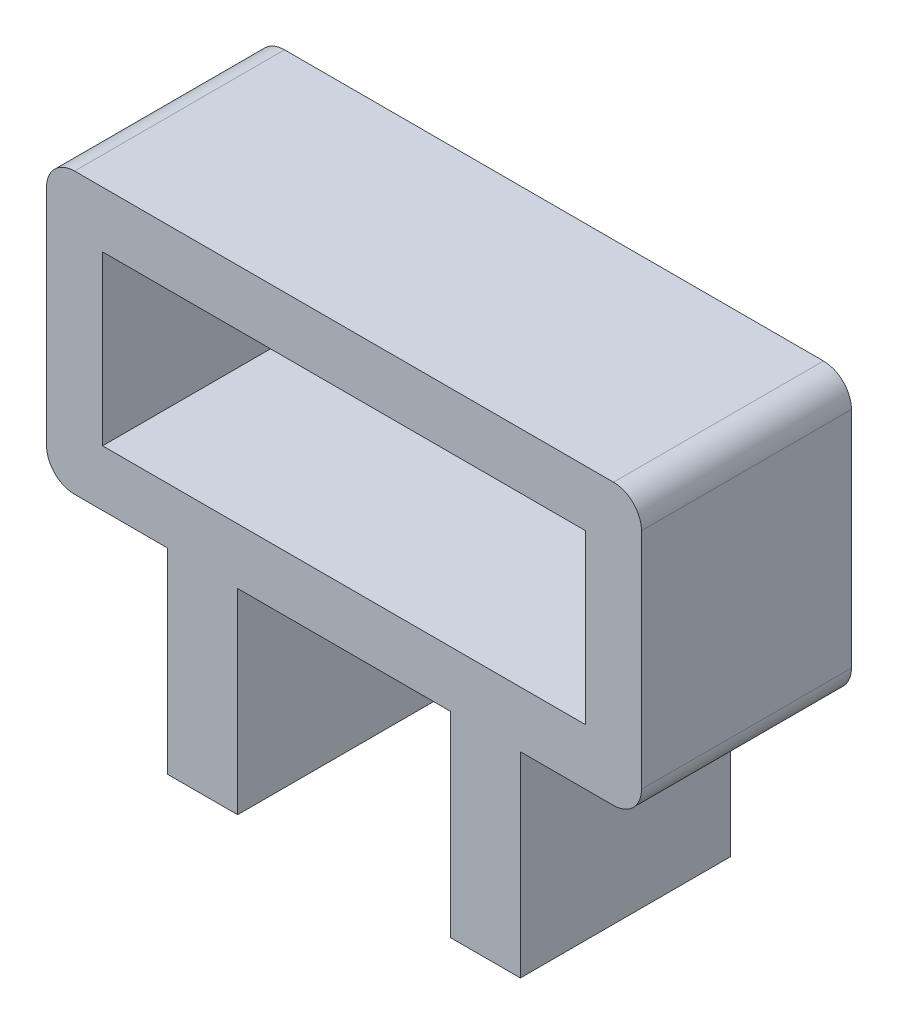
ISO-10303-21;
HEADER;
FILE_DESCRIPTION(('STEP AP214'),'2;1');
FILE_NAME('part.step','',(''),(''),'','','');
FILE_SCHEMA(('AUTOMOTIVE_DESIGN { 1 0 10303 214 1 1 1 1 }'));
ENDSEC;
DATA;
#1=APPLICATION_CONTEXT('core data for automotive mechanical design processes');
#2=APPLICATION_PROTOCOL_DEFINITION('international standard','automotive_design',2000,#1);
#3=PRODUCT_CONTEXT('',#1,'mechanical');
#4=PRODUCT('Part','Part','',(#3));
#5=PRODUCT_RELATED_PRODUCT_CATEGORY('part','',(#4));
#6=PRODUCT_DEFINITION_FORMATION('','',#4);
#7=PRODUCT_DEFINITION_CONTEXT('part definition',#1,'design');
#8=PRODUCT_DEFINITION('design','',#6,#7);
#9=PRODUCT_DEFINITION_SHAPE('','',#8);
#10=(LENGTH_UNIT() NAMED_UNIT(*) SI_UNIT(.MILLI.,.METRE.));
#11=(NAMED_UNIT(*) PLANE_ANGLE_UNIT() SI_UNIT($,.RADIAN.));
#12=(NAMED_UNIT(*) SI_UNIT($,.STERADIAN.) SOLID_ANGLE_UNIT());
#13=UNCERTAINTY_MEASURE_WITH_UNIT(LENGTH_MEASURE(1.E-05),#10,'distance_accuracy_value','');
#14=(GEOMETRIC_REPRESENTATION_CONTEXT(3) GLOBAL_UNCERTAINTY_ASSIGNED_CONTEXT((#13)) GLOBAL_UNIT_ASSIGNED_CONTEXT((#10,
#11,#12)) REPRESENTATION_CONTEXT('',''));
#15=CARTESIAN_POINT('',(0.,0.,0.));
#16=DIRECTION('',(0.,0.,1.));
#17=DIRECTION('',(1.,0.,0.));
#18=AXIS2_PLACEMENT_3D('',#15,#16,#17);
#19=CARTESIAN_POINT('',(0.,0.,15.));
#20=DIRECTION('',(0.,0.,-1.));
#21=DIRECTION('',(-1.,0.,0.));
#22=AXIS2_PLACEMENT_3D('',#19,#20,#21);
#23=PLANE('',#22);
#24=DIRECTION('',(0.,-1.,0.));
#25=VECTOR('',#24,1.);
#26=CARTESIAN_POINT('',(-40.8047171963891,20.4370103244966,15.));
#27=LINE('',#26,#25);
#28=CARTESIAN_POINT('',(-40.8047171963891,18.4370103244966,15.));
#29=VERTEX_POINT('',#28);
#30=CARTESIAN_POINT('',(-40.8047171963891,2.43701032449661,15.));
#31=VERTEX_POINT('',#30);
#32=EDGE_CURVE('E220',#29,#31,#27,.T.);
#33=ORIENTED_EDGE('',*,*,#32,.T.);
#34=CARTESIAN_POINT('',(-38.8047171963891,2.43701032449661,15.));
#35=DIRECTION('',(0.,0.,-1.));
#36=DIRECTION('',(-1.,0.,0.));
#37=AXIS2_PLACEMENT_3D('',#34,#35,#36);
#38=CIRCLE('',#37,2.);
#39=CARTESIAN_POINT('',(-38.8047171963891,0.437010324496612,15.));
#40=VERTEX_POINT('',#39);
#41=EDGE_CURVE('E309',#31,#40,#38,.F.);
#42=ORIENTED_EDGE('',*,*,#41,.T.);
#43=DIRECTION('',(1.,0.,0.));
#44=VECTOR('',#43,1.);
#45=CARTESIAN_POINT('',(-40.8047171963891,0.437010324496612,15.));
#46=LINE('',#45,#44);
#47=CARTESIAN_POINT('',(-32.1547171963891,0.437010324496613,15.));
#48=VERTEX_POINT('',#47);
#49=EDGE_CURVE('E223',#40,#48,#46,.T.);
#50=ORIENTED_EDGE('',*,*,#49,.T.);
#51=DIRECTION('',(0.,-1.,0.));
#52=VECTOR('',#51,1.);
#53=CARTESIAN_POINT('',(-32.1547171963891,-13.5629896755034,15.));
#54=LINE('',#53,#52);
#55=CARTESIAN_POINT('',(-32.1547171963891,-13.5629896755034,15.));
#56=VERTEX_POINT('',#55);
#57=EDGE_CURVE('E225',#48,#56,#54,.T.);
#58=ORIENTED_EDGE('',*,*,#57,.T.);
#59=DIRECTION('',(1.,0.,0.));
#60=VECTOR('',#59,1.);
#61=CARTESIAN_POINT('',(-27.1547171963891,-13.5629896755034,15.));
#62=LINE('',#61,#60);
#63=CARTESIAN_POINT('',(-27.1547171963891,-13.5629896755034,15.));
#64=VERTEX_POINT('',#63);
#65=EDGE_CURVE('E227',#56,#64,#62,.T.);
#66=ORIENTED_EDGE('',*,*,#65,.T.);
#67=DIRECTION('',(0.,1.,0.));
#68=VECTOR('',#67,1.);
#69=CARTESIAN_POINT('',(-27.1547171963891,0.437010324496613,15.));
#70=LINE('',#69,#68);
#71=CARTESIAN_POINT('',(-27.1547171963891,0.437010324496613,15.));
#72=VERTEX_POINT('',#71);
#73=EDGE_CURVE('E229',#64,#72,#70,.T.);
#74=ORIENTED_EDGE('',*,*,#73,.T.);
#75=DIRECTION('',(1.,0.,0.));
#76=VECTOR('',#75,1.);
#77=CARTESIAN_POINT('',(-27.1547171963891,0.437010324496613,15.));
#78=LINE('',#77,#76);
#79=CARTESIAN_POINT('',(-11.9547171963891,0.437010324496613,15.));
#80=VERTEX_POINT('',#79);
#81=EDGE_CURVE('E231',#72,#80,#78,.T.);
#82=ORIENTED_EDGE('',*,*,#81,.T.);
#83=DIRECTION('',(0.,-1.,0.));
#84=VECTOR('',#83,1.);
#85=CARTESIAN_POINT('',(-11.9547171963891,0.437010324496613,15.));
#86=LINE('',#85,#84);
#87=CARTESIAN_POINT('',(-11.9547171963891,-13.5629896755034,15.));
#88=VERTEX_POINT('',#87);
#89=EDGE_CURVE('E233',#80,#88,#86,.T.);
#90=ORIENTED_EDGE('',*,*,#89,.T.);
#91=DIRECTION('',(1.,0.,0.));
#92=VECTOR('',#91,1.);
#93=CARTESIAN_POINT('',(-11.9547171963891,-13.5629896755034,15.));
#94=LINE('',#93,#92);
#95=CARTESIAN_POINT('',(-6.95471719638909,-13.5629896755034,15.));
#96=VERTEX_POINT('',#95);
#97=EDGE_CURVE('E235',#88,#96,#94,.T.);
#98=ORIENTED_EDGE('',*,*,#97,.T.);
#99=DIRECTION('',(0.,1.,0.));
#100=VECTOR('',#99,1.);
#101=CARTESIAN_POINT('',(-6.95471719638909,-13.5629896755034,15.));
#102=LINE('',#101,#100);
#103=CARTESIAN_POINT('',(-6.95471719638909,0.437010324496613,15.));
#104=VERTEX_POINT('',#103);
#105=EDGE_CURVE('E237',#96,#104,#102,.T.);
#106=ORIENTED_EDGE('',*,*,#105,.T.);
#107=DIRECTION('',(1.,0.,0.));
#108=VECTOR('',#107,1.);
#109=CARTESIAN_POINT('',(-6.95471719638909,0.437010324496613,15.));
#110=LINE('',#109,#108);
#111=CARTESIAN_POINT('',(-0.304717196389081,0.437010324496618,15.));
#112=VERTEX_POINT('',#111);
#113=EDGE_CURVE('E212',#104,#112,#110,.T.);
#114=ORIENTED_EDGE('',*,*,#113,.T.);
#115=CARTESIAN_POINT('',(-0.304717196389082,2.43701032449662,15.));
#116=DIRECTION('',(0.,0.,-1.));
#117=DIRECTION('',(-1.,0.,0.));
#118=AXIS2_PLACEMENT_3D('',#115,#116,#117);
#119=CIRCLE('',#118,2.);
#120=CARTESIAN_POINT('',(1.69528280361092,2.43701032449662,15.));
#121=VERTEX_POINT('',#120);
#122=EDGE_CURVE('E307',#112,#121,#119,.F.);
#123=ORIENTED_EDGE('',*,*,#122,.T.);
#124=DIRECTION('',(0.,1.,0.));
#125=VECTOR('',#124,1.);
#126=CARTESIAN_POINT('',(1.69528280361091,20.4370103244966,15.));
#127=LINE('',#126,#125);
#128=CARTESIAN_POINT('',(1.69528280361091,18.4370103244966,15.));
#129=VERTEX_POINT('',#128);
#130=EDGE_CURVE('E215',#121,#129,#127,.T.);
#131=ORIENTED_EDGE('',*,*,#130,.T.);
#132=CARTESIAN_POINT('',(-0.304717196389089,18.4370103244966,15.));
#133=DIRECTION('',(0.,0.,-1.));
#134=DIRECTION('',(-1.,0.,0.));
#135=AXIS2_PLACEMENT_3D('',#132,#133,#134);
#136=CIRCLE('',#135,2.);
#137=CARTESIAN_POINT('',(-0.304717196389089,20.4370103244966,15.));
#138=VERTEX_POINT('',#137);
#139=EDGE_CURVE('E53',#129,#138,#136,.F.);
#140=ORIENTED_EDGE('',*,*,#139,.T.);
#141=DIRECTION('',(-1.,0.,0.));
#142=VECTOR('',#141,1.);
#143=CARTESIAN_POINT('',(-40.8047171963891,20.4370103244966,15.));
#144=LINE('',#143,#142);
#145=CARTESIAN_POINT('',(-38.8047171963891,20.4370103244966,15.));
#146=VERTEX_POINT('',#145);
#147=EDGE_CURVE('E218',#138,#146,#144,.T.);
#148=ORIENTED_EDGE('',*,*,#147,.T.);
#149=CARTESIAN_POINT('',(-38.8047171963891,18.4370103244966,15.));
#150=DIRECTION('',(0.,0.,-1.));
#151=DIRECTION('',(-1.,0.,0.));
#152=AXIS2_PLACEMENT_3D('',#149,#150,#151);
#153=CIRCLE('',#152,2.);
#154=EDGE_CURVE('E305',#146,#29,#153,.F.);
#155=ORIENTED_EDGE('',*,*,#154,.T.);
#156=EDGE_LOOP('',(#33,#42,#50,#58,#66,#74,#82,#90,#98,#106,#114,#123,#131,#140,#148,#155));
#157=FACE_BOUND('',#156,.T.);
#158=DIRECTION('',(0.,1.,0.));
#159=VECTOR('',#158,1.);
#160=CARTESIAN_POINT('',(-2.30471719638909,16.4370103244966,15.));
#161=LINE('',#160,#159);
#162=CARTESIAN_POINT('',(-2.30471719638909,4.43701032449661,15.));
#163=VERTEX_POINT('',#162);
#164=CARTESIAN_POINT('',(-2.30471719638909,16.4370103244966,15.));
#165=VERTEX_POINT('',#164);
#166=EDGE_CURVE('E171',#163,#165,#161,.T.);
#167=ORIENTED_EDGE('',*,*,#166,.F.);
#168=DIRECTION('',(1.,0.,0.));
#169=VECTOR('',#168,1.);
#170=CARTESIAN_POINT('',(-36.8047171963891,4.43701032449661,15.));
#171=LINE('',#170,#169);
#172=CARTESIAN_POINT('',(-36.8047171963891,4.43701032449661,15.));
#173=VERTEX_POINT('',#172);
#174=EDGE_CURVE('E196',#173,#163,#171,.T.);
#175=ORIENTED_EDGE('',*,*,#174,.F.);
#176=DIRECTION('',(0.,-1.,0.));
#177=VECTOR('',#176,1.);
#178=CARTESIAN_POINT('',(-36.8047171963891,16.4370103244966,15.));
#179=LINE('',#178,#177);
#180=CARTESIAN_POINT('',(-36.8047171963891,16.4370103244966,15.));
#181=VERTEX_POINT('',#180);
#182=EDGE_CURVE('E194',#181,#173,#179,.T.);
#183=ORIENTED_EDGE('',*,*,#182,.F.);
#184=DIRECTION('',(-1.,0.,0.));
#185=VECTOR('',#184,1.);
#186=CARTESIAN_POINT('',(-36.8047171963891,16.4370103244966,15.));
#187=LINE('',#186,#185);
#188=EDGE_CURVE('E181',#165,#181,#187,.T.);
#189=ORIENTED_EDGE('',*,*,#188,.F.);
#190=EDGE_LOOP('',(#167,#175,#183,#189));
#191=FACE_BOUND('',#190,.T.);
#192=ADVANCED_FACE('F33',(#157,#191),#23,.F.);
#193=CARTESIAN_POINT('',(0.,0.,0.));
#194=DIRECTION('',(0.,0.,-1.));
#195=DIRECTION('',(-1.,0.,0.));
#196=AXIS2_PLACEMENT_3D('',#193,#194,#195);
#197=PLANE('',#196);
#198=DIRECTION('',(1.,0.,0.));
#199=VECTOR('',#198,1.);
#200=CARTESIAN_POINT('',(-40.8047171963891,0.437010324496612,0.));
#201=LINE('',#200,#199);
#202=CARTESIAN_POINT('',(-38.8047171963891,0.437010324496612,0.));
#203=VERTEX_POINT('',#202);
#204=CARTESIAN_POINT('',(-32.1547171963891,0.437010324496613,0.));
#205=VERTEX_POINT('',#204);
#206=EDGE_CURVE('E250',#203,#205,#201,.T.);
#207=ORIENTED_EDGE('',*,*,#206,.F.);
#208=CARTESIAN_POINT('',(-38.8047171963891,2.43701032449661,0.));
#209=DIRECTION('',(0.,0.,-1.));
#210=DIRECTION('',(-1.,0.,0.));
#211=AXIS2_PLACEMENT_3D('',#208,#209,#210);
#212=CIRCLE('',#211,2.);
#213=CARTESIAN_POINT('',(-40.8047171963891,2.43701032449661,0.));
#214=VERTEX_POINT('',#213);
#215=EDGE_CURVE('E297',#203,#214,#212,.T.);
#216=ORIENTED_EDGE('',*,*,#215,.T.);
#217=DIRECTION('',(0.,-1.,0.));
#218=VECTOR('',#217,1.);
#219=CARTESIAN_POINT('',(-40.8047171963891,20.4370103244966,0.));
#220=LINE('',#219,#218);
#221=CARTESIAN_POINT('',(-40.8047171963891,18.4370103244966,0.));
#222=VERTEX_POINT('',#221);
#223=EDGE_CURVE('E247',#222,#214,#220,.T.);
#224=ORIENTED_EDGE('',*,*,#223,.F.);
#225=CARTESIAN_POINT('',(-38.8047171963891,18.4370103244966,0.));
#226=DIRECTION('',(0.,0.,-1.));
#227=DIRECTION('',(-1.,0.,0.));
#228=AXIS2_PLACEMENT_3D('',#225,#226,#227);
#229=CIRCLE('',#228,2.);
#230=CARTESIAN_POINT('',(-38.8047171963891,20.4370103244966,0.));
#231=VERTEX_POINT('',#230);
#232=EDGE_CURVE('E293',#222,#231,#229,.T.);
#233=ORIENTED_EDGE('',*,*,#232,.T.);
#234=DIRECTION('',(-1.,0.,0.));
#235=VECTOR('',#234,1.);
#236=CARTESIAN_POINT('',(-40.8047171963891,20.4370103244966,0.));
#237=LINE('',#236,#235);
#238=CARTESIAN_POINT('',(-0.304717196389089,20.4370103244966,0.));
#239=VERTEX_POINT('',#238);
#240=EDGE_CURVE('E245',#239,#231,#237,.T.);
#241=ORIENTED_EDGE('',*,*,#240,.F.);
#242=CARTESIAN_POINT('',(-0.304717196389089,18.4370103244966,0.));
#243=DIRECTION('',(0.,0.,-1.));
#244=DIRECTION('',(-1.,0.,0.));
#245=AXIS2_PLACEMENT_3D('',#242,#243,#244);
#246=CIRCLE('',#245,2.);
#247=CARTESIAN_POINT('',(1.69528280361091,18.4370103244966,0.));
#248=VERTEX_POINT('',#247);
#249=EDGE_CURVE('E291',#239,#248,#246,.T.);
#250=ORIENTED_EDGE('',*,*,#249,.T.);
#251=DIRECTION('',(0.,1.,0.));
#252=VECTOR('',#251,1.);
#253=CARTESIAN_POINT('',(1.69528280361091,20.4370103244966,0.));
#254=LINE('',#253,#252);
#255=CARTESIAN_POINT('',(1.69528280361092,2.43701032449662,0.));
#256=VERTEX_POINT('',#255);
#257=EDGE_CURVE('E242',#256,#248,#254,.T.);
#258=ORIENTED_EDGE('',*,*,#257,.F.);
#259=CARTESIAN_POINT('',(-0.304717196389082,2.43701032449662,0.));
#260=DIRECTION('',(0.,0.,-1.));
#261=DIRECTION('',(-1.,0.,0.));
#262=AXIS2_PLACEMENT_3D('',#259,#260,#261);
#263=CIRCLE('',#262,2.);
#264=CARTESIAN_POINT('',(-0.304717196389081,0.437010324496618,0.));
#265=VERTEX_POINT('',#264);
#266=EDGE_CURVE('E295',#256,#265,#263,.T.);
#267=ORIENTED_EDGE('',*,*,#266,.T.);
#268=DIRECTION('',(1.,0.,0.));
#269=VECTOR('',#268,1.);
#270=CARTESIAN_POINT('',(-6.95471719638909,0.437010324496613,0.));
#271=LINE('',#270,#269);
#272=CARTESIAN_POINT('',(-6.95471719638909,0.437010324496613,0.));
#273=VERTEX_POINT('',#272);
#274=EDGE_CURVE('E189',#273,#265,#271,.T.);
#275=ORIENTED_EDGE('',*,*,#274,.F.);
#276=DIRECTION('',(0.,1.,0.));
#277=VECTOR('',#276,1.);
#278=CARTESIAN_POINT('',(-6.95471719638909,-13.5629896755034,0.));
#279=LINE('',#278,#277);
#280=CARTESIAN_POINT('',(-6.95471719638909,-13.5629896755034,0.));
#281=VERTEX_POINT('',#280);
#282=EDGE_CURVE('E216',#281,#273,#279,.T.);
#283=ORIENTED_EDGE('',*,*,#282,.F.);
#284=DIRECTION('',(1.,0.,0.));
#285=VECTOR('',#284,1.);
#286=CARTESIAN_POINT('',(-11.9547171963891,-13.5629896755034,0.));
#287=LINE('',#286,#285);
#288=CARTESIAN_POINT('',(-11.9547171963891,-13.5629896755034,0.));
#289=VERTEX_POINT('',#288);
#290=EDGE_CURVE('E262',#289,#281,#287,.T.);
#291=ORIENTED_EDGE('',*,*,#290,.F.);
#292=DIRECTION('',(0.,-1.,0.));
#293=VECTOR('',#292,1.);
#294=CARTESIAN_POINT('',(-11.9547171963891,0.437010324496613,0.));
#295=LINE('',#294,#293);
#296=CARTESIAN_POINT('',(-11.9547171963891,0.437010324496613,0.));
#297=VERTEX_POINT('',#296);
#298=EDGE_CURVE('E260',#297,#289,#295,.T.);
#299=ORIENTED_EDGE('',*,*,#298,.F.);
#300=DIRECTION('',(1.,0.,0.));
#301=VECTOR('',#300,1.);
#302=CARTESIAN_POINT('',(-27.1547171963891,0.437010324496613,0.));
#303=LINE('',#302,#301);
#304=CARTESIAN_POINT('',(-27.1547171963891,0.437010324496613,0.));
#305=VERTEX_POINT('',#304);
#306=EDGE_CURVE('E258',#305,#297,#303,.T.);
#307=ORIENTED_EDGE('',*,*,#306,.F.);
#308=DIRECTION('',(0.,1.,0.));
#309=VECTOR('',#308,1.);
#310=CARTESIAN_POINT('',(-27.1547171963891,0.437010324496613,0.));
#311=LINE('',#310,#309);
#312=CARTESIAN_POINT('',(-27.1547171963891,-13.5629896755034,0.));
#313=VERTEX_POINT('',#312);
#314=EDGE_CURVE('E256',#313,#305,#311,.T.);
#315=ORIENTED_EDGE('',*,*,#314,.F.);
#316=DIRECTION('',(1.,0.,0.));
#317=VECTOR('',#316,1.);
#318=CARTESIAN_POINT('',(-27.1547171963891,-13.5629896755034,0.));
#319=LINE('',#318,#317);
#320=CARTESIAN_POINT('',(-32.1547171963891,-13.5629896755034,0.));
#321=VERTEX_POINT('',#320);
#322=EDGE_CURVE('E254',#321,#313,#319,.T.);
#323=ORIENTED_EDGE('',*,*,#322,.F.);
#324=DIRECTION('',(0.,-1.,0.));
#325=VECTOR('',#324,1.);
#326=CARTESIAN_POINT('',(-32.1547171963891,-13.5629896755034,0.));
#327=LINE('',#326,#325);
#328=EDGE_CURVE('E252',#205,#321,#327,.T.);
#329=ORIENTED_EDGE('',*,*,#328,.F.);
#330=EDGE_LOOP('',(#207,#216,#224,#233,#241,#250,#258,#267,#275,#283,#291,#299,#307,#315,#323,#329));
#331=FACE_BOUND('',#330,.T.);
#332=DIRECTION('',(1.,0.,0.));
#333=VECTOR('',#332,1.);
#334=CARTESIAN_POINT('',(-36.8047171963891,4.43701032449661,0.));
#335=LINE('',#334,#333);
#336=CARTESIAN_POINT('',(-36.8047171963891,4.43701032449661,0.));
#337=VERTEX_POINT('',#336);
#338=CARTESIAN_POINT('',(-2.30471719638909,4.43701032449661,0.));
#339=VERTEX_POINT('',#338);
#340=EDGE_CURVE('E182',#337,#339,#335,.T.);
#341=ORIENTED_EDGE('',*,*,#340,.T.);
#342=DIRECTION('',(0.,1.,0.));
#343=VECTOR('',#342,1.);
#344=CARTESIAN_POINT('',(-2.30471719638909,16.4370103244966,0.));
#345=LINE('',#344,#343);
#346=CARTESIAN_POINT('',(-2.30471719638909,16.4370103244966,0.));
#347=VERTEX_POINT('',#346);
#348=EDGE_CURVE('E200',#339,#347,#345,.T.);
#349=ORIENTED_EDGE('',*,*,#348,.T.);
#350=DIRECTION('',(-1.,0.,0.));
#351=VECTOR('',#350,1.);
#352=CARTESIAN_POINT('',(-36.8047171963891,16.4370103244966,0.));
#353=LINE('',#352,#351);
#354=CARTESIAN_POINT('',(-36.8047171963891,16.4370103244966,0.));
#355=VERTEX_POINT('',#354);
#356=EDGE_CURVE('E188',#347,#355,#353,.T.);
#357=ORIENTED_EDGE('',*,*,#356,.T.);
#358=DIRECTION('',(0.,-1.,0.));
#359=VECTOR('',#358,1.);
#360=CARTESIAN_POINT('',(-36.8047171963891,16.4370103244966,0.));
#361=LINE('',#360,#359);
#362=EDGE_CURVE('E203',#355,#337,#361,.T.);
#363=ORIENTED_EDGE('',*,*,#362,.T.);
#364=EDGE_LOOP('',(#341,#349,#357,#363));
#365=FACE_BOUND('',#364,.T.);
#366=ADVANCED_FACE('F324',(#331,#365),#197,.T.);
#367=CARTESIAN_POINT('',(-6.95471719638909,0.437010324496613,15.));
#368=DIRECTION('',(0.,1.,0.));
#369=DIRECTION('',(-1.,0.,0.));
#370=AXIS2_PLACEMENT_3D('',#367,#368,#369);
#371=PLANE('',#370);
#372=ORIENTED_EDGE('',*,*,#274,.T.);
#373=DIRECTION('',(0.,0.,-1.));
#374=VECTOR('',#373,1.);
#375=CARTESIAN_POINT('',(-0.304717196389081,0.437010324496618,15.));
#376=LINE('',#375,#374);
#377=EDGE_CURVE('E316',#265,#112,#376,.F.);
#378=ORIENTED_EDGE('',*,*,#377,.T.);
#379=ORIENTED_EDGE('',*,*,#113,.F.);
#380=DIRECTION('',(0.,0.,-1.));
#381=VECTOR('',#380,1.);
#382=CARTESIAN_POINT('',(-6.95471719638909,0.437010324496613,15.));
#383=LINE('',#382,#381);
#384=EDGE_CURVE('E239',#104,#273,#383,.T.);
#385=ORIENTED_EDGE('',*,*,#384,.T.);
#386=EDGE_LOOP('',(#372,#378,#379,#385));
#387=FACE_BOUND('',#386,.T.);
#388=ADVANCED_FACE('F382',(#387),#371,.F.);
#389=CARTESIAN_POINT('',(1.69528280361091,20.4370103244966,15.));
#390=DIRECTION('',(-1.,0.,0.));
#391=DIRECTION('',(0.,-1.,0.));
#392=AXIS2_PLACEMENT_3D('',#389,#390,#391);
#393=PLANE('',#392);
#394=ORIENTED_EDGE('',*,*,#130,.F.);
#395=DIRECTION('',(0.,0.,-1.));
#396=VECTOR('',#395,1.);
#397=CARTESIAN_POINT('',(1.69528280361092,2.43701032449662,15.));
#398=LINE('',#397,#396);
#399=EDGE_CURVE('E313',#121,#256,#398,.T.);
#400=ORIENTED_EDGE('',*,*,#399,.T.);
#401=ORIENTED_EDGE('',*,*,#257,.T.);
#402=DIRECTION('',(0.,0.,-1.));
#403=VECTOR('',#402,1.);
#404=CARTESIAN_POINT('',(1.69528280361091,18.4370103244966,15.));
#405=LINE('',#404,#403);
#406=EDGE_CURVE('E311',#248,#129,#405,.F.);
#407=ORIENTED_EDGE('',*,*,#406,.T.);
#408=EDGE_LOOP('',(#394,#400,#401,#407));
#409=FACE_BOUND('',#408,.T.);
#410=ADVANCED_FACE('F390',(#409),#393,.F.);
#411=CARTESIAN_POINT('',(-40.8047171963891,20.4370103244966,15.));
#412=DIRECTION('',(0.,-1.,0.));
#413=DIRECTION('',(1.,0.,0.));
#414=AXIS2_PLACEMENT_3D('',#411,#412,#413);
#415=PLANE('',#414);
#416=ORIENTED_EDGE('',*,*,#240,.T.);
#417=DIRECTION('',(0.,0.,-1.));
#418=VECTOR('',#417,1.);
#419=CARTESIAN_POINT('',(-38.8047171963891,20.4370103244966,15.));
#420=LINE('',#419,#418);
#421=EDGE_CURVE('E11',#231,#146,#420,.F.);
#422=ORIENTED_EDGE('',*,*,#421,.T.);
#423=ORIENTED_EDGE('',*,*,#147,.F.);
#424=DIRECTION('',(0.,0.,-1.));
#425=VECTOR('',#424,1.);
#426=CARTESIAN_POINT('',(-0.304717196389089,20.4370103244966,15.));
#427=LINE('',#426,#425);
#428=EDGE_CURVE('E41',#138,#239,#427,.T.);
#429=ORIENTED_EDGE('',*,*,#428,.T.);
#430=EDGE_LOOP('',(#416,#422,#423,#429));
#431=FACE_BOUND('',#430,.T.);
#432=ADVANCED_FACE('F320',(#431),#415,.F.);
#433=CARTESIAN_POINT('',(-40.8047171963891,20.4370103244966,15.));
#434=DIRECTION('',(1.,0.,0.));
#435=DIRECTION('',(0.,0.,-1.));
#436=AXIS2_PLACEMENT_3D('',#433,#434,#435);
#437=PLANE('',#436);
#438=ORIENTED_EDGE('',*,*,#223,.T.);
#439=DIRECTION('',(0.,0.,-1.));
#440=VECTOR('',#439,1.);
#441=CARTESIAN_POINT('',(-40.8047171963891,2.43701032449661,15.));
#442=LINE('',#441,#440);
#443=EDGE_CURVE('E302',#214,#31,#442,.F.);
#444=ORIENTED_EDGE('',*,*,#443,.T.);
#445=ORIENTED_EDGE('',*,*,#32,.F.);
#446=DIRECTION('',(0.,0.,-1.));
#447=VECTOR('',#446,1.);
#448=CARTESIAN_POINT('',(-40.8047171963891,18.4370103244966,15.));
#449=LINE('',#448,#447);
#450=EDGE_CURVE('E299',#29,#222,#449,.T.);
#451=ORIENTED_EDGE('',*,*,#450,.T.);
#452=EDGE_LOOP('',(#438,#444,#445,#451));
#453=FACE_BOUND('',#452,.T.);
#454=ADVANCED_FACE('F334',(#453),#437,.F.);
#455=CARTESIAN_POINT('',(-40.8047171963891,0.437010324496612,15.));
#456=DIRECTION('',(0.,1.,0.));
#457=DIRECTION('',(-1.,0.,0.));
#458=AXIS2_PLACEMENT_3D('',#455,#456,#457);
#459=PLANE('',#458);
#460=ORIENTED_EDGE('',*,*,#49,.F.);
#461=DIRECTION('',(0.,0.,-1.));
#462=VECTOR('',#461,1.);
#463=CARTESIAN_POINT('',(-38.8047171963891,0.437010324496612,15.));
#464=LINE('',#463,#462);
#465=EDGE_CURVE('E288',#40,#203,#464,.T.);
#466=ORIENTED_EDGE('',*,*,#465,.T.);
#467=ORIENTED_EDGE('',*,*,#206,.T.);
#468=DIRECTION('',(0.,0.,-1.));
#469=VECTOR('',#468,1.);
#470=CARTESIAN_POINT('',(-32.1547171963891,0.437010324496613,15.));
#471=LINE('',#470,#469);
#472=EDGE_CURVE('E285',#48,#205,#471,.T.);
#473=ORIENTED_EDGE('',*,*,#472,.F.);
#474=EDGE_LOOP('',(#460,#466,#467,#473));
#475=FACE_BOUND('',#474,.T.);
#476=ADVANCED_FACE('F342',(#475),#459,.F.);
#477=CARTESIAN_POINT('',(-32.1547171963891,-13.5629896755034,15.));
#478=DIRECTION('',(1.,0.,0.));
#479=DIRECTION('',(0.,1.,0.));
#480=AXIS2_PLACEMENT_3D('',#477,#478,#479);
#481=PLANE('',#480);
#482=ORIENTED_EDGE('',*,*,#328,.T.);
#483=DIRECTION('',(0.,0.,-1.));
#484=VECTOR('',#483,1.);
#485=CARTESIAN_POINT('',(-32.1547171963891,-13.5629896755034,15.));
#486=LINE('',#485,#484);
#487=EDGE_CURVE('E282',#56,#321,#486,.T.);
#488=ORIENTED_EDGE('',*,*,#487,.F.);
#489=ORIENTED_EDGE('',*,*,#57,.F.);
#490=ORIENTED_EDGE('',*,*,#472,.T.);
#491=EDGE_LOOP('',(#482,#488,#489,#490));
#492=FACE_BOUND('',#491,.T.);
#493=ADVANCED_FACE('F349',(#492),#481,.F.);
#494=CARTESIAN_POINT('',(-27.1547171963891,-13.5629896755034,15.));
#495=DIRECTION('',(0.,1.,0.));
#496=DIRECTION('',(0.,0.,1.));
#497=AXIS2_PLACEMENT_3D('',#494,#495,#496);
#498=PLANE('',#497);
#499=ORIENTED_EDGE('',*,*,#322,.T.);
#500=DIRECTION('',(0.,0.,-1.));
#501=VECTOR('',#500,1.);
#502=CARTESIAN_POINT('',(-27.1547171963891,-13.5629896755034,15.));
#503=LINE('',#502,#501);
#504=EDGE_CURVE('E279',#64,#313,#503,.T.);
#505=ORIENTED_EDGE('',*,*,#504,.F.);
#506=ORIENTED_EDGE('',*,*,#65,.F.);
#507=ORIENTED_EDGE('',*,*,#487,.T.);
#508=EDGE_LOOP('',(#499,#505,#506,#507));
#509=FACE_BOUND('',#508,.T.);
#510=ADVANCED_FACE('F353',(#509),#498,.F.);
#511=CARTESIAN_POINT('',(-27.1547171963891,0.437010324496613,15.));
#512=DIRECTION('',(-1.,0.,0.));
#513=DIRECTION('',(0.,0.,1.));
#514=AXIS2_PLACEMENT_3D('',#511,#512,#513);
#515=PLANE('',#514);
#516=ORIENTED_EDGE('',*,*,#314,.T.);
#517=DIRECTION('',(0.,0.,-1.));
#518=VECTOR('',#517,1.);
#519=CARTESIAN_POINT('',(-27.1547171963891,0.437010324496613,15.));
#520=LINE('',#519,#518);
#521=EDGE_CURVE('E276',#72,#305,#520,.T.);
#522=ORIENTED_EDGE('',*,*,#521,.F.);
#523=ORIENTED_EDGE('',*,*,#73,.F.);
#524=ORIENTED_EDGE('',*,*,#504,.T.);
#525=EDGE_LOOP('',(#516,#522,#523,#524));
#526=FACE_BOUND('',#525,.T.);
#527=ADVANCED_FACE('F360',(#526),#515,.F.);
#528=CARTESIAN_POINT('',(-27.1547171963891,0.437010324496613,15.));
#529=DIRECTION('',(0.,1.,0.));
#530=DIRECTION('',(-1.,0.,0.));
#531=AXIS2_PLACEMENT_3D('',#528,#529,#530);
#532=PLANE('',#531);
#533=ORIENTED_EDGE('',*,*,#306,.T.);
#534=DIRECTION('',(0.,0.,-1.));
#535=VECTOR('',#534,1.);
#536=CARTESIAN_POINT('',(-11.9547171963891,0.437010324496613,15.));
#537=LINE('',#536,#535);
#538=EDGE_CURVE('E273',#80,#297,#537,.T.);
#539=ORIENTED_EDGE('',*,*,#538,.F.);
#540=ORIENTED_EDGE('',*,*,#81,.F.);
#541=ORIENTED_EDGE('',*,*,#521,.T.);
#542=EDGE_LOOP('',(#533,#539,#540,#541));
#543=FACE_BOUND('',#542,.T.);
#544=ADVANCED_FACE('F363',(#543),#532,.F.);
#545=CARTESIAN_POINT('',(-11.9547171963891,0.437010324496613,15.));
#546=DIRECTION('',(1.,0.,0.));
#547=DIRECTION('',(0.,1.,0.));
#548=AXIS2_PLACEMENT_3D('',#545,#546,#547);
#549=PLANE('',#548);
#550=ORIENTED_EDGE('',*,*,#298,.T.);
#551=DIRECTION('',(0.,0.,-1.));
#552=VECTOR('',#551,1.);
#553=CARTESIAN_POINT('',(-11.9547171963891,-13.5629896755034,15.));
#554=LINE('',#553,#552);
#555=EDGE_CURVE('E270',#88,#289,#554,.T.);
#556=ORIENTED_EDGE('',*,*,#555,.F.);
#557=ORIENTED_EDGE('',*,*,#89,.F.);
#558=ORIENTED_EDGE('',*,*,#538,.T.);
#559=EDGE_LOOP('',(#550,#556,#557,#558));
#560=FACE_BOUND('',#559,.T.);
#561=ADVANCED_FACE('F368',(#560),#549,.F.);
#562=CARTESIAN_POINT('',(-11.9547171963891,-13.5629896755034,15.));
#563=DIRECTION('',(0.,1.,0.));
#564=DIRECTION('',(-1.,0.,0.));
#565=AXIS2_PLACEMENT_3D('',#562,#563,#564);
#566=PLANE('',#565);
#567=ORIENTED_EDGE('',*,*,#290,.T.);
#568=DIRECTION('',(0.,0.,-1.));
#569=VECTOR('',#568,1.);
#570=CARTESIAN_POINT('',(-6.95471719638909,-13.5629896755034,15.));
#571=LINE('',#570,#569);
#572=EDGE_CURVE('E267',#96,#281,#571,.T.);
#573=ORIENTED_EDGE('',*,*,#572,.F.);
#574=ORIENTED_EDGE('',*,*,#97,.F.);
#575=ORIENTED_EDGE('',*,*,#555,.T.);
#576=EDGE_LOOP('',(#567,#573,#574,#575));
#577=FACE_BOUND('',#576,.T.);
#578=ADVANCED_FACE('F374',(#577),#566,.F.);
#579=CARTESIAN_POINT('',(-6.95471719638909,-13.5629896755034,15.));
#580=DIRECTION('',(-1.,0.,0.));
#581=DIRECTION('',(0.,0.,1.));
#582=AXIS2_PLACEMENT_3D('',#579,#580,#581);
#583=PLANE('',#582);
#584=ORIENTED_EDGE('',*,*,#282,.T.);
#585=ORIENTED_EDGE('',*,*,#384,.F.);
#586=ORIENTED_EDGE('',*,*,#105,.F.);
#587=ORIENTED_EDGE('',*,*,#572,.T.);
#588=EDGE_LOOP('',(#584,#585,#586,#587));
#589=FACE_BOUND('',#588,.T.);
#590=ADVANCED_FACE('F378',(#589),#583,.F.);
#591=CARTESIAN_POINT('',(-2.30471719638909,16.4370103244966,15.));
#592=DIRECTION('',(-1.,0.,0.));
#593=DIRECTION('',(0.,-1.,0.));
#594=AXIS2_PLACEMENT_3D('',#591,#592,#593);
#595=PLANE('',#594);
#596=ORIENTED_EDGE('',*,*,#348,.F.);
#597=DIRECTION('',(0.,0.,-1.));
#598=VECTOR('',#597,1.);
#599=CARTESIAN_POINT('',(-2.30471719638909,4.43701032449661,15.));
#600=LINE('',#599,#598);
#601=EDGE_CURVE('E177',#163,#339,#600,.T.);
#602=ORIENTED_EDGE('',*,*,#601,.F.);
#603=ORIENTED_EDGE('',*,*,#166,.T.);
#604=DIRECTION('',(0.,0.,-1.));
#605=VECTOR('',#604,1.);
#606=CARTESIAN_POINT('',(-2.30471719638909,16.4370103244966,15.));
#607=LINE('',#606,#605);
#608=EDGE_CURVE('E174',#165,#347,#607,.T.);
#609=ORIENTED_EDGE('',*,*,#608,.T.);
#610=EDGE_LOOP('',(#596,#602,#603,#609));
#611=FACE_BOUND('',#610,.T.);
#612=ADVANCED_FACE('F173',(#611),#595,.T.);
#613=CARTESIAN_POINT('',(-36.8047171963891,16.4370103244966,15.));
#614=DIRECTION('',(0.,-1.,0.));
#615=DIRECTION('',(0.,0.,-1.));
#616=AXIS2_PLACEMENT_3D('',#613,#614,#615);
#617=PLANE('',#616);
#618=ORIENTED_EDGE('',*,*,#356,.F.);
#619=ORIENTED_EDGE('',*,*,#608,.F.);
#620=ORIENTED_EDGE('',*,*,#188,.T.);
#621=DIRECTION('',(0.,0.,-1.));
#622=VECTOR('',#621,1.);
#623=CARTESIAN_POINT('',(-36.8047171963891,16.4370103244966,15.));
#624=LINE('',#623,#622);
#625=EDGE_CURVE('E190',#181,#355,#624,.T.);
#626=ORIENTED_EDGE('',*,*,#625,.T.);
#627=EDGE_LOOP('',(#618,#619,#620,#626));
#628=FACE_BOUND('',#627,.T.);
#629=ADVANCED_FACE('F185',(#628),#617,.T.);
#630=CARTESIAN_POINT('',(-36.8047171963891,16.4370103244966,15.));
#631=DIRECTION('',(1.,0.,0.));
#632=DIRECTION('',(0.,1.,0.));
#633=AXIS2_PLACEMENT_3D('',#630,#631,#632);
#634=PLANE('',#633);
#635=ORIENTED_EDGE('',*,*,#362,.F.);
#636=ORIENTED_EDGE('',*,*,#625,.F.);
#637=ORIENTED_EDGE('',*,*,#182,.T.);
#638=DIRECTION('',(0.,0.,-1.));
#639=VECTOR('',#638,1.);
#640=CARTESIAN_POINT('',(-36.8047171963891,4.43701032449661,15.));
#641=LINE('',#640,#639);
#642=EDGE_CURVE('E209',#173,#337,#641,.T.);
#643=ORIENTED_EDGE('',*,*,#642,.T.);
#644=EDGE_LOOP('',(#635,#636,#637,#643));
#645=FACE_BOUND('',#644,.T.);
#646=ADVANCED_FACE('F462',(#645),#634,.T.);
#647=CARTESIAN_POINT('',(-36.8047171963891,4.43701032449661,15.));
#648=DIRECTION('',(0.,1.,0.));
#649=DIRECTION('',(0.,0.,1.));
#650=AXIS2_PLACEMENT_3D('',#647,#648,#649);
#651=PLANE('',#650);
#652=ORIENTED_EDGE('',*,*,#340,.F.);
#653=ORIENTED_EDGE('',*,*,#642,.F.);
#654=ORIENTED_EDGE('',*,*,#174,.T.);
#655=ORIENTED_EDGE('',*,*,#601,.T.);
#656=EDGE_LOOP('',(#652,#653,#654,#655));
#657=FACE_BOUND('',#656,.T.);
#658=ADVANCED_FACE('F431',(#657),#651,.T.);
#659=CARTESIAN_POINT('',(-38.8047171963891,2.43701032449661,15.));
#660=DIRECTION('',(0.,0.,-1.));
#661=DIRECTION('',(-1.,0.,0.));
#662=AXIS2_PLACEMENT_3D('',#659,#660,#661);
#663=CYLINDRICAL_SURFACE('',#662,2.);
#664=ORIENTED_EDGE('',*,*,#41,.F.);
#665=ORIENTED_EDGE('',*,*,#443,.F.);
#666=ORIENTED_EDGE('',*,*,#215,.F.);
#667=ORIENTED_EDGE('',*,*,#465,.F.);
#668=EDGE_LOOP('',(#664,#665,#666,#667));
#669=FACE_BOUND('',#668,.T.);
#670=ADVANCED_FACE('F340',(#669),#663,.T.);
#671=CARTESIAN_POINT('',(-0.304717196389082,2.43701032449662,15.));
#672=DIRECTION('',(0.,0.,-1.));
#673=DIRECTION('',(-1.,0.,0.));
#674=AXIS2_PLACEMENT_3D('',#671,#672,#673);
#675=CYLINDRICAL_SURFACE('',#674,2.);
#676=ORIENTED_EDGE('',*,*,#122,.F.);
#677=ORIENTED_EDGE('',*,*,#377,.F.);
#678=ORIENTED_EDGE('',*,*,#266,.F.);
#679=ORIENTED_EDGE('',*,*,#399,.F.);
#680=EDGE_LOOP('',(#676,#677,#678,#679));
#681=FACE_BOUND('',#680,.T.);
#682=ADVANCED_FACE('F388',(#681),#675,.T.);
#683=CARTESIAN_POINT('',(-38.8047171963891,18.4370103244966,15.));
#684=DIRECTION('',(0.,0.,-1.));
#685=DIRECTION('',(-1.,0.,0.));
#686=AXIS2_PLACEMENT_3D('',#683,#684,#685);
#687=CYLINDRICAL_SURFACE('',#686,2.);
#688=ORIENTED_EDGE('',*,*,#154,.F.);
#689=ORIENTED_EDGE('',*,*,#421,.F.);
#690=ORIENTED_EDGE('',*,*,#232,.F.);
#691=ORIENTED_EDGE('',*,*,#450,.F.);
#692=EDGE_LOOP('',(#688,#689,#690,#691));
#693=FACE_BOUND('',#692,.T.);
#694=ADVANCED_FACE('F331',(#693),#687,.T.);
#695=CARTESIAN_POINT('',(-0.304717196389089,18.4370103244966,15.));
#696=DIRECTION('',(0.,0.,-1.));
#697=DIRECTION('',(-1.,0.,0.));
#698=AXIS2_PLACEMENT_3D('',#695,#696,#697);
#699=CYLINDRICAL_SURFACE('',#698,2.);
#700=ORIENTED_EDGE('',*,*,#139,.F.);
#701=ORIENTED_EDGE('',*,*,#406,.F.);
#702=ORIENTED_EDGE('',*,*,#249,.F.);
#703=ORIENTED_EDGE('',*,*,#428,.F.);
#704=EDGE_LOOP('',(#700,#701,#702,#703));
#705=FACE_BOUND('',#704,.T.);
#706=ADVANCED_FACE('F35',(#705),#699,.T.);
#707=CLOSED_SHELL('',(#192,#366,#388,#410,#432,#454,#476,#493,#510,#527,#544,#561,#578,#590,
#612,#629,#646,#658,#670,#682,#694,#706));
#708=MANIFOLD_SOLID_BREP('B2',#707);
#709=ADVANCED_BREP_SHAPE_REPRESENTATION('',(#18,#708),#14);
#710=SHAPE_DEFINITION_REPRESENTATION(#9,#709);
ENDSEC;
END-ISO-10303-21;
